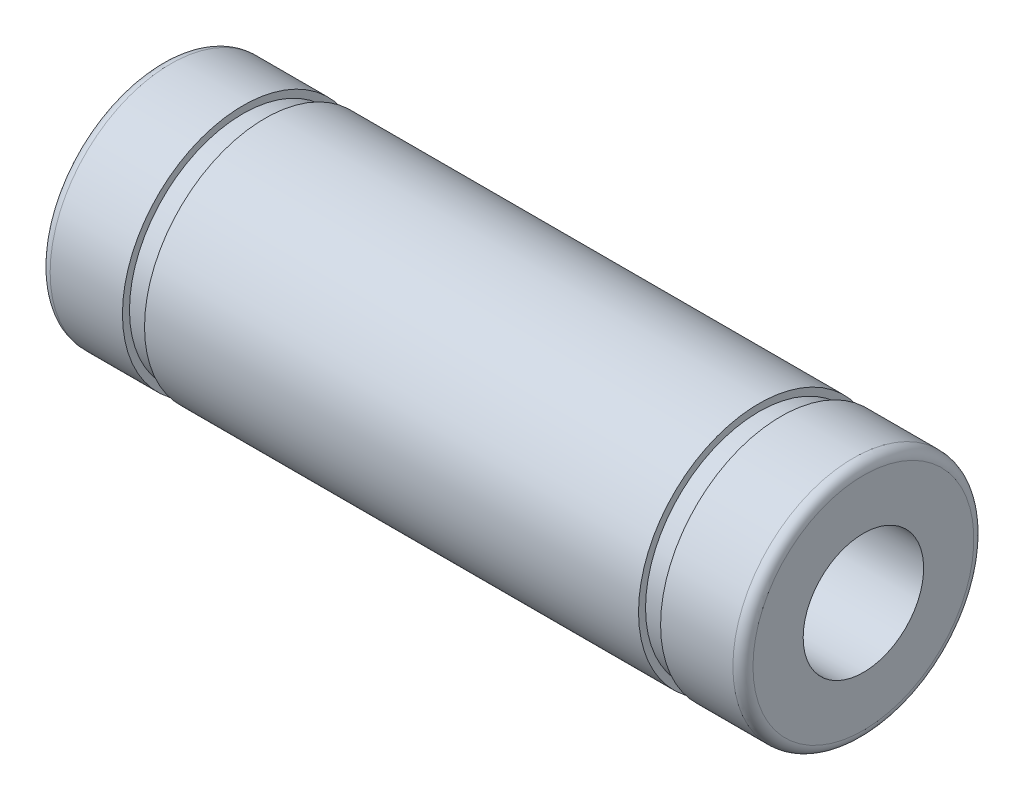
ISO-10303-21;
HEADER;
FILE_DESCRIPTION(('STEP AP214'),'2;1');
FILE_NAME('part.step','',(''),(''),'','','');
FILE_SCHEMA(('AUTOMOTIVE_DESIGN { 1 0 10303 214 1 1 1 1 }'));
ENDSEC;
DATA;
#1=APPLICATION_CONTEXT('core data for automotive mechanical design processes');
#2=APPLICATION_PROTOCOL_DEFINITION('international standard','automotive_design',2000,#1);
#3=PRODUCT_CONTEXT('',#1,'mechanical');
#4=PRODUCT('Part','Part','',(#3));
#5=PRODUCT_RELATED_PRODUCT_CATEGORY('part','',(#4));
#6=PRODUCT_DEFINITION_FORMATION('','',#4);
#7=PRODUCT_DEFINITION_CONTEXT('part definition',#1,'design');
#8=PRODUCT_DEFINITION('design','',#6,#7);
#9=PRODUCT_DEFINITION_SHAPE('','',#8);
#10=(LENGTH_UNIT() NAMED_UNIT(*) SI_UNIT(.MILLI.,.METRE.));
#11=(NAMED_UNIT(*) PLANE_ANGLE_UNIT() SI_UNIT($,.RADIAN.));
#12=(NAMED_UNIT(*) SI_UNIT($,.STERADIAN.) SOLID_ANGLE_UNIT());
#13=UNCERTAINTY_MEASURE_WITH_UNIT(LENGTH_MEASURE(1.E-05),#10,'distance_accuracy_value','');
#14=(GEOMETRIC_REPRESENTATION_CONTEXT(3) GLOBAL_UNCERTAINTY_ASSIGNED_CONTEXT((#13)) GLOBAL_UNIT_ASSIGNED_CONTEXT((#10,
#11,#12)) REPRESENTATION_CONTEXT('',''));
#15=CARTESIAN_POINT('',(0.,0.,0.));
#16=DIRECTION('',(0.,0.,1.));
#17=DIRECTION('',(1.,0.,0.));
#18=AXIS2_PLACEMENT_3D('',#15,#16,#17);
#19=CARTESIAN_POINT('',(-17.5,0.,-6.));
#20=DIRECTION('',(1.,0.,0.));
#21=DIRECTION('',(0.,0.,-1.));
#22=AXIS2_PLACEMENT_3D('',#19,#20,#21);
#23=PLANE('',#22);
#24=CARTESIAN_POINT('',(-17.5,0.,0.));
#25=DIRECTION('',(1.,0.,0.));
#26=DIRECTION('',(0.,0.,-1.));
#27=AXIS2_PLACEMENT_3D('',#24,#25,#26);
#28=CIRCLE('',#27,5.5);
#29=CARTESIAN_POINT('',(-17.5,0.,-5.5));
#30=VERTEX_POINT('',#29);
#31=EDGE_CURVE('E57',#30,#30,#28,.F.);
#32=ORIENTED_EDGE('',*,*,#31,.T.);
#33=EDGE_LOOP('',(#32));
#34=FACE_BOUND('',#33,.T.);
#35=CARTESIAN_POINT('',(-17.5,0.,0.));
#36=DIRECTION('',(-1.,0.,0.));
#37=DIRECTION('',(0.,0.,1.));
#38=AXIS2_PLACEMENT_3D('',#35,#36,#37);
#39=CIRCLE('',#38,3.);
#40=CARTESIAN_POINT('',(-17.5,0.,3.));
#41=VERTEX_POINT('',#40);
#42=EDGE_CURVE('E89',#41,#41,#39,.T.);
#43=ORIENTED_EDGE('',*,*,#42,.F.);
#44=EDGE_LOOP('',(#43));
#45=FACE_BOUND('',#44,.T.);
#46=ADVANCED_FACE('F42',(#34,#45),#23,.F.);
#47=CARTESIAN_POINT('',(0.,0.,0.));
#48=DIRECTION('',(-1.,0.,0.));
#49=DIRECTION('',(0.,0.,1.));
#50=AXIS2_PLACEMENT_3D('',#47,#48,#49);
#51=CYLINDRICAL_SURFACE('',#50,6.);
#52=CARTESIAN_POINT('',(-17.,0.,0.));
#53=DIRECTION('',(1.,0.,0.));
#54=DIRECTION('',(0.,0.,-1.));
#55=AXIS2_PLACEMENT_3D('',#52,#53,#54);
#56=CIRCLE('',#55,6.);
#57=CARTESIAN_POINT('',(-17.,0.,-6.));
#58=VERTEX_POINT('',#57);
#59=EDGE_CURVE('E53',#58,#58,#56,.T.);
#60=ORIENTED_EDGE('',*,*,#59,.T.);
#61=EDGE_LOOP('',(#60));
#62=FACE_BOUND('',#61,.T.);
#63=CARTESIAN_POINT('',(-13.4,0.,0.));
#64=DIRECTION('',(-1.,0.,0.));
#65=DIRECTION('',(0.,0.,1.));
#66=AXIS2_PLACEMENT_3D('',#63,#64,#65);
#67=CIRCLE('',#66,6.);
#68=CARTESIAN_POINT('',(-13.4,0.,6.));
#69=VERTEX_POINT('',#68);
#70=EDGE_CURVE('E62',#69,#69,#67,.T.);
#71=ORIENTED_EDGE('',*,*,#70,.T.);
#72=EDGE_LOOP('',(#71));
#73=FACE_BOUND('',#72,.T.);
#74=ADVANCED_FACE('F96',(#62,#73),#51,.T.);
#75=CARTESIAN_POINT('',(-13.4,0.,-5.65));
#76=DIRECTION('',(-1.,0.,0.));
#77=DIRECTION('',(0.,0.,1.));
#78=AXIS2_PLACEMENT_3D('',#75,#76,#77);
#79=PLANE('',#78);
#80=ORIENTED_EDGE('',*,*,#70,.F.);
#81=EDGE_LOOP('',(#80));
#82=FACE_BOUND('',#81,.T.);
#83=CARTESIAN_POINT('',(-13.4,0.,0.));
#84=DIRECTION('',(-1.,0.,0.));
#85=DIRECTION('',(0.,0.,1.));
#86=AXIS2_PLACEMENT_3D('',#83,#84,#85);
#87=CIRCLE('',#86,5.65);
#88=CARTESIAN_POINT('',(-13.4,0.,5.65));
#89=VERTEX_POINT('',#88);
#90=EDGE_CURVE('E65',#89,#89,#87,.T.);
#91=ORIENTED_EDGE('',*,*,#90,.T.);
#92=EDGE_LOOP('',(#91));
#93=FACE_BOUND('',#92,.T.);
#94=ADVANCED_FACE('F102',(#82,#93),#79,.F.);
#95=CARTESIAN_POINT('',(0.,0.,0.));
#96=DIRECTION('',(-1.,0.,0.));
#97=DIRECTION('',(0.,0.,1.));
#98=AXIS2_PLACEMENT_3D('',#95,#96,#97);
#99=CYLINDRICAL_SURFACE('',#98,5.65);
#100=ORIENTED_EDGE('',*,*,#90,.F.);
#101=EDGE_LOOP('',(#100));
#102=FACE_BOUND('',#101,.T.);
#103=CARTESIAN_POINT('',(-12.3,0.,0.));
#104=DIRECTION('',(-1.,0.,0.));
#105=DIRECTION('',(0.,0.,1.));
#106=AXIS2_PLACEMENT_3D('',#103,#104,#105);
#107=CIRCLE('',#106,5.65);
#108=CARTESIAN_POINT('',(-12.3,0.,5.65));
#109=VERTEX_POINT('',#108);
#110=EDGE_CURVE('E68',#109,#109,#107,.T.);
#111=ORIENTED_EDGE('',*,*,#110,.T.);
#112=EDGE_LOOP('',(#111));
#113=FACE_BOUND('',#112,.T.);
#114=ADVANCED_FACE('F125',(#102,#113),#99,.T.);
#115=CARTESIAN_POINT('',(-12.3,0.,-6.));
#116=DIRECTION('',(1.,0.,0.));
#117=DIRECTION('',(0.,0.,-1.));
#118=AXIS2_PLACEMENT_3D('',#115,#116,#117);
#119=PLANE('',#118);
#120=ORIENTED_EDGE('',*,*,#110,.F.);
#121=EDGE_LOOP('',(#120));
#122=FACE_BOUND('',#121,.T.);
#123=CARTESIAN_POINT('',(-12.3,0.,0.));
#124=DIRECTION('',(-1.,0.,0.));
#125=DIRECTION('',(0.,0.,1.));
#126=AXIS2_PLACEMENT_3D('',#123,#124,#125);
#127=CIRCLE('',#126,6.);
#128=CARTESIAN_POINT('',(-12.3,0.,6.));
#129=VERTEX_POINT('',#128);
#130=EDGE_CURVE('E71',#129,#129,#127,.T.);
#131=ORIENTED_EDGE('',*,*,#130,.T.);
#132=EDGE_LOOP('',(#131));
#133=FACE_BOUND('',#132,.T.);
#134=ADVANCED_FACE('F130',(#122,#133),#119,.F.);
#135=CARTESIAN_POINT('',(0.,0.,0.));
#136=DIRECTION('',(-1.,0.,0.));
#137=DIRECTION('',(0.,0.,1.));
#138=AXIS2_PLACEMENT_3D('',#135,#136,#137);
#139=CYLINDRICAL_SURFACE('',#138,6.);
#140=ORIENTED_EDGE('',*,*,#130,.F.);
#141=EDGE_LOOP('',(#140));
#142=FACE_BOUND('',#141,.T.);
#143=CARTESIAN_POINT('',(12.3,0.,0.));
#144=DIRECTION('',(-1.,0.,0.));
#145=DIRECTION('',(0.,0.,1.));
#146=AXIS2_PLACEMENT_3D('',#143,#144,#145);
#147=CIRCLE('',#146,6.);
#148=CARTESIAN_POINT('',(12.3,0.,6.));
#149=VERTEX_POINT('',#148);
#150=EDGE_CURVE('E74',#149,#149,#147,.T.);
#151=ORIENTED_EDGE('',*,*,#150,.T.);
#152=EDGE_LOOP('',(#151));
#153=FACE_BOUND('',#152,.T.);
#154=ADVANCED_FACE('F136',(#142,#153),#139,.T.);
#155=CARTESIAN_POINT('',(12.3,0.,-6.));
#156=DIRECTION('',(-1.,0.,0.));
#157=DIRECTION('',(0.,0.,1.));
#158=AXIS2_PLACEMENT_3D('',#155,#156,#157);
#159=PLANE('',#158);
#160=ORIENTED_EDGE('',*,*,#150,.F.);
#161=EDGE_LOOP('',(#160));
#162=FACE_BOUND('',#161,.T.);
#163=CARTESIAN_POINT('',(12.3,0.,0.));
#164=DIRECTION('',(-1.,0.,0.));
#165=DIRECTION('',(0.,0.,1.));
#166=AXIS2_PLACEMENT_3D('',#163,#164,#165);
#167=CIRCLE('',#166,5.65);
#168=CARTESIAN_POINT('',(12.3,0.,5.65));
#169=VERTEX_POINT('',#168);
#170=EDGE_CURVE('E77',#169,#169,#167,.T.);
#171=ORIENTED_EDGE('',*,*,#170,.T.);
#172=EDGE_LOOP('',(#171));
#173=FACE_BOUND('',#172,.T.);
#174=ADVANCED_FACE('F142',(#162,#173),#159,.F.);
#175=CARTESIAN_POINT('',(0.,0.,0.));
#176=DIRECTION('',(-1.,0.,0.));
#177=DIRECTION('',(0.,0.,1.));
#178=AXIS2_PLACEMENT_3D('',#175,#176,#177);
#179=CYLINDRICAL_SURFACE('',#178,5.65);
#180=ORIENTED_EDGE('',*,*,#170,.F.);
#181=EDGE_LOOP('',(#180));
#182=FACE_BOUND('',#181,.T.);
#183=CARTESIAN_POINT('',(13.4,0.,0.));
#184=DIRECTION('',(-1.,0.,0.));
#185=DIRECTION('',(0.,0.,1.));
#186=AXIS2_PLACEMENT_3D('',#183,#184,#185);
#187=CIRCLE('',#186,5.65);
#188=CARTESIAN_POINT('',(13.4,0.,5.65));
#189=VERTEX_POINT('',#188);
#190=EDGE_CURVE('E80',#189,#189,#187,.T.);
#191=ORIENTED_EDGE('',*,*,#190,.T.);
#192=EDGE_LOOP('',(#191));
#193=FACE_BOUND('',#192,.T.);
#194=ADVANCED_FACE('F148',(#182,#193),#179,.T.);
#195=CARTESIAN_POINT('',(13.4,0.,-5.65));
#196=DIRECTION('',(1.,0.,0.));
#197=DIRECTION('',(0.,0.,-1.));
#198=AXIS2_PLACEMENT_3D('',#195,#196,#197);
#199=PLANE('',#198);
#200=ORIENTED_EDGE('',*,*,#190,.F.);
#201=EDGE_LOOP('',(#200));
#202=FACE_BOUND('',#201,.T.);
#203=CARTESIAN_POINT('',(13.4,0.,0.));
#204=DIRECTION('',(-1.,0.,0.));
#205=DIRECTION('',(0.,0.,1.));
#206=AXIS2_PLACEMENT_3D('',#203,#204,#205);
#207=CIRCLE('',#206,6.);
#208=CARTESIAN_POINT('',(13.4,0.,6.));
#209=VERTEX_POINT('',#208);
#210=EDGE_CURVE('E83',#209,#209,#207,.T.);
#211=ORIENTED_EDGE('',*,*,#210,.T.);
#212=EDGE_LOOP('',(#211));
#213=FACE_BOUND('',#212,.T.);
#214=ADVANCED_FACE('F154',(#202,#213),#199,.F.);
#215=CARTESIAN_POINT('',(0.,0.,0.));
#216=DIRECTION('',(-1.,0.,0.));
#217=DIRECTION('',(0.,0.,1.));
#218=AXIS2_PLACEMENT_3D('',#215,#216,#217);
#219=CYLINDRICAL_SURFACE('',#218,6.);
#220=CARTESIAN_POINT('',(17.,0.,0.));
#221=DIRECTION('',(-1.,0.,0.));
#222=DIRECTION('',(0.,0.,1.));
#223=AXIS2_PLACEMENT_3D('',#220,#221,#222);
#224=CIRCLE('',#223,6.);
#225=CARTESIAN_POINT('',(17.,0.,6.));
#226=VERTEX_POINT('',#225);
#227=EDGE_CURVE('E49',#226,#226,#224,.T.);
#228=ORIENTED_EDGE('',*,*,#227,.T.);
#229=EDGE_LOOP('',(#228));
#230=FACE_BOUND('',#229,.T.);
#231=ORIENTED_EDGE('',*,*,#210,.F.);
#232=EDGE_LOOP('',(#231));
#233=FACE_BOUND('',#232,.T.);
#234=ADVANCED_FACE('F160',(#230,#233),#219,.T.);
#235=CARTESIAN_POINT('',(17.5,0.,-6.));
#236=DIRECTION('',(-1.,0.,0.));
#237=DIRECTION('',(0.,0.,1.));
#238=AXIS2_PLACEMENT_3D('',#235,#236,#237);
#239=PLANE('',#238);
#240=CARTESIAN_POINT('',(17.5,0.,0.));
#241=DIRECTION('',(-1.,0.,0.));
#242=DIRECTION('',(0.,0.,1.));
#243=AXIS2_PLACEMENT_3D('',#240,#241,#242);
#244=CIRCLE('',#243,5.5);
#245=CARTESIAN_POINT('',(17.5,0.,5.5));
#246=VERTEX_POINT('',#245);
#247=EDGE_CURVE('E12',#246,#246,#244,.F.);
#248=ORIENTED_EDGE('',*,*,#247,.T.);
#249=EDGE_LOOP('',(#248));
#250=FACE_BOUND('',#249,.T.);
#251=CARTESIAN_POINT('',(17.5,0.,0.));
#252=DIRECTION('',(-1.,0.,0.));
#253=DIRECTION('',(0.,0.,1.));
#254=AXIS2_PLACEMENT_3D('',#251,#252,#253);
#255=CIRCLE('',#254,3.);
#256=CARTESIAN_POINT('',(17.5,0.,3.));
#257=VERTEX_POINT('',#256);
#258=EDGE_CURVE('E86',#257,#257,#255,.T.);
#259=ORIENTED_EDGE('',*,*,#258,.T.);
#260=EDGE_LOOP('',(#259));
#261=FACE_BOUND('',#260,.T.);
#262=ADVANCED_FACE('F114',(#250,#261),#239,.F.);
#263=CARTESIAN_POINT('',(0.,0.,0.));
#264=DIRECTION('',(-1.,0.,0.));
#265=DIRECTION('',(0.,0.,1.));
#266=AXIS2_PLACEMENT_3D('',#263,#264,#265);
#267=CYLINDRICAL_SURFACE('',#266,3.);
#268=ORIENTED_EDGE('',*,*,#258,.F.);
#269=EDGE_LOOP('',(#268));
#270=FACE_BOUND('',#269,.T.);
#271=ORIENTED_EDGE('',*,*,#42,.T.);
#272=EDGE_LOOP('',(#271));
#273=FACE_BOUND('',#272,.T.);
#274=ADVANCED_FACE('F93',(#270,#273),#267,.F.);
#275=CARTESIAN_POINT('',(-17.,0.,0.));
#276=DIRECTION('',(1.,0.,0.));
#277=DIRECTION('',(0.,0.,-1.));
#278=AXIS2_PLACEMENT_3D('',#275,#276,#277);
#279=TOROIDAL_SURFACE('',#278,5.5,0.5);
#280=ORIENTED_EDGE('',*,*,#59,.F.);
#281=EDGE_LOOP('',(#280));
#282=FACE_BOUND('',#281,.T.);
#283=ORIENTED_EDGE('',*,*,#31,.F.);
#284=EDGE_LOOP('',(#283));
#285=FACE_BOUND('',#284,.T.);
#286=ADVANCED_FACE('F106',(#282,#285),#279,.T.);
#287=CARTESIAN_POINT('',(17.,0.,0.));
#288=DIRECTION('',(-1.,0.,0.));
#289=DIRECTION('',(0.,0.,1.));
#290=AXIS2_PLACEMENT_3D('',#287,#288,#289);
#291=TOROIDAL_SURFACE('',#290,5.5,0.5);
#292=ORIENTED_EDGE('',*,*,#247,.F.);
#293=EDGE_LOOP('',(#292));
#294=FACE_BOUND('',#293,.T.);
#295=ORIENTED_EDGE('',*,*,#227,.F.);
#296=EDGE_LOOP('',(#295));
#297=FACE_BOUND('',#296,.T.);
#298=ADVANCED_FACE('F44',(#294,#297),#291,.T.);
#299=CLOSED_SHELL('',(#46,#74,#94,#114,#134,#154,#174,#194,#214,#234,#262,#274,#286,#298));
#300=MANIFOLD_SOLID_BREP('B2',#299);
#301=ADVANCED_BREP_SHAPE_REPRESENTATION('',(#18,#300),#14);
#302=SHAPE_DEFINITION_REPRESENTATION(#9,#301);
ENDSEC;
END-ISO-10303-21;
